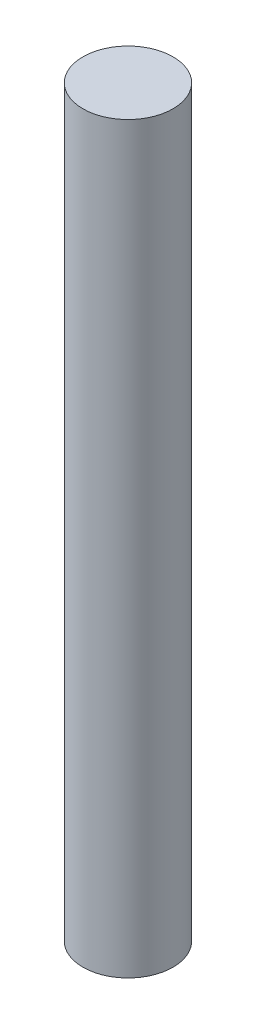
ISO-10303-21;
HEADER;
FILE_DESCRIPTION(('STEP AP214'),'2;1');
FILE_NAME('part.step','',(''),(''),'','','');
FILE_SCHEMA(('AUTOMOTIVE_DESIGN { 1 0 10303 214 1 1 1 1 }'));
ENDSEC;
DATA;
#1=APPLICATION_CONTEXT('core data for automotive mechanical design processes');
#2=APPLICATION_PROTOCOL_DEFINITION('international standard','automotive_design',2000,#1);
#3=PRODUCT_CONTEXT('',#1,'mechanical');
#4=PRODUCT('Part','Part','',(#3));
#5=PRODUCT_RELATED_PRODUCT_CATEGORY('part','',(#4));
#6=PRODUCT_DEFINITION_FORMATION('','',#4);
#7=PRODUCT_DEFINITION_CONTEXT('part definition',#1,'design');
#8=PRODUCT_DEFINITION('design','',#6,#7);
#9=PRODUCT_DEFINITION_SHAPE('','',#8);
#10=(LENGTH_UNIT() NAMED_UNIT(*) SI_UNIT(.MILLI.,.METRE.));
#11=(NAMED_UNIT(*) PLANE_ANGLE_UNIT() SI_UNIT($,.RADIAN.));
#12=(NAMED_UNIT(*) SI_UNIT($,.STERADIAN.) SOLID_ANGLE_UNIT());
#13=UNCERTAINTY_MEASURE_WITH_UNIT(LENGTH_MEASURE(1.E-05),#10,'distance_accuracy_value','');
#14=(GEOMETRIC_REPRESENTATION_CONTEXT(3) GLOBAL_UNCERTAINTY_ASSIGNED_CONTEXT((#13)) GLOBAL_UNIT_ASSIGNED_CONTEXT((#10,
#11,#12)) REPRESENTATION_CONTEXT('',''));
#15=CARTESIAN_POINT('',(0.,0.,0.));
#16=DIRECTION('',(0.,0.,1.));
#17=DIRECTION('',(1.,0.,0.));
#18=AXIS2_PLACEMENT_3D('',#15,#16,#17);
#19=CARTESIAN_POINT('',(0.,16.5,0.));
#20=DIRECTION('',(0.,-1.,0.));
#21=DIRECTION('',(0.,0.,-1.));
#22=AXIS2_PLACEMENT_3D('',#19,#20,#21);
#23=CYLINDRICAL_SURFACE('',#22,1.);
#24=CARTESIAN_POINT('',(0.,16.5,0.));
#25=DIRECTION('',(0.,1.,0.));
#26=DIRECTION('',(0.,0.,1.));
#27=AXIS2_PLACEMENT_3D('',#24,#25,#26);
#28=CIRCLE('',#27,1.);
#29=CARTESIAN_POINT('',(0.,16.5,1.));
#30=VERTEX_POINT('',#29);
#31=EDGE_CURVE('E10',#30,#30,#28,.T.);
#32=ORIENTED_EDGE('',*,*,#31,.F.);
#33=EDGE_LOOP('',(#32));
#34=FACE_BOUND('',#33,.T.);
#35=CARTESIAN_POINT('',(0.,0.,0.));
#36=DIRECTION('',(0.,1.,0.));
#37=DIRECTION('',(0.,0.,1.));
#38=AXIS2_PLACEMENT_3D('',#35,#36,#37);
#39=CIRCLE('',#38,1.);
#40=CARTESIAN_POINT('',(0.,0.,1.));
#41=VERTEX_POINT('',#40);
#42=EDGE_CURVE('E40',#41,#41,#39,.T.);
#43=ORIENTED_EDGE('',*,*,#42,.T.);
#44=EDGE_LOOP('',(#43));
#45=FACE_BOUND('',#44,.T.);
#46=ADVANCED_FACE('F37',(#34,#45),#23,.T.);
#47=CARTESIAN_POINT('',(0.,16.5,0.));
#48=DIRECTION('',(0.,1.,0.));
#49=DIRECTION('',(0.,0.,1.));
#50=AXIS2_PLACEMENT_3D('',#47,#48,#49);
#51=PLANE('',#50);
#52=ORIENTED_EDGE('',*,*,#31,.T.);
#53=EDGE_LOOP('',(#52));
#54=FACE_BOUND('',#53,.T.);
#55=ADVANCED_FACE('F54',(#54),#51,.T.);
#56=CARTESIAN_POINT('',(0.,0.,0.));
#57=DIRECTION('',(0.,1.,0.));
#58=DIRECTION('',(0.,0.,1.));
#59=AXIS2_PLACEMENT_3D('',#56,#57,#58);
#60=PLANE('',#59);
#61=ORIENTED_EDGE('',*,*,#42,.F.);
#62=EDGE_LOOP('',(#61));
#63=FACE_BOUND('',#62,.T.);
#64=ADVANCED_FACE('F52',(#63),#60,.F.);
#65=CLOSED_SHELL('',(#46,#55,#64));
#66=MANIFOLD_SOLID_BREP('B2',#65);
#67=ADVANCED_BREP_SHAPE_REPRESENTATION('',(#18,#66),#14);
#68=SHAPE_DEFINITION_REPRESENTATION(#9,#67);
ENDSEC;
END-ISO-10303-21;
